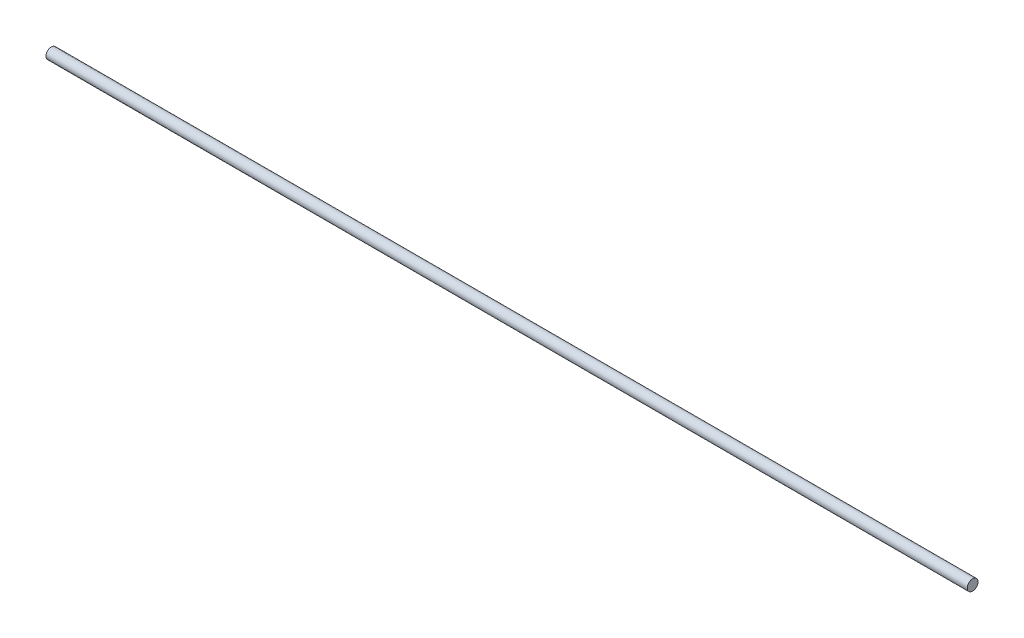
ISO-10303-21;
HEADER;
FILE_DESCRIPTION(('STEP AP214'),'2;1');
FILE_NAME('part.step','',(''),(''),'','','');
FILE_SCHEMA(('AUTOMOTIVE_DESIGN { 1 0 10303 214 1 1 1 1 }'));
ENDSEC;
DATA;
#1=APPLICATION_CONTEXT('core data for automotive mechanical design processes');
#2=APPLICATION_PROTOCOL_DEFINITION('international standard','automotive_design',2000,#1);
#3=PRODUCT_CONTEXT('',#1,'mechanical');
#4=PRODUCT('Part','Part','',(#3));
#5=PRODUCT_RELATED_PRODUCT_CATEGORY('part','',(#4));
#6=PRODUCT_DEFINITION_FORMATION('','',#4);
#7=PRODUCT_DEFINITION_CONTEXT('part definition',#1,'design');
#8=PRODUCT_DEFINITION('design','',#6,#7);
#9=PRODUCT_DEFINITION_SHAPE('','',#8);
#10=(LENGTH_UNIT() NAMED_UNIT(*) SI_UNIT(.MILLI.,.METRE.));
#11=(NAMED_UNIT(*) PLANE_ANGLE_UNIT() SI_UNIT($,.RADIAN.));
#12=(NAMED_UNIT(*) SI_UNIT($,.STERADIAN.) SOLID_ANGLE_UNIT());
#13=UNCERTAINTY_MEASURE_WITH_UNIT(LENGTH_MEASURE(1.E-05),#10,'distance_accuracy_value','');
#14=(GEOMETRIC_REPRESENTATION_CONTEXT(3) GLOBAL_UNCERTAINTY_ASSIGNED_CONTEXT((#13)) GLOBAL_UNIT_ASSIGNED_CONTEXT((#10,
#11,#12)) REPRESENTATION_CONTEXT('',''));
#15=CARTESIAN_POINT('',(0.,0.,0.));
#16=DIRECTION('',(0.,0.,1.));
#17=DIRECTION('',(1.,0.,0.));
#18=AXIS2_PLACEMENT_3D('',#15,#16,#17);
#19=CARTESIAN_POINT('',(150.,0.,0.));
#20=DIRECTION('',(-1.,0.,0.));
#21=DIRECTION('',(0.,0.,1.));
#22=AXIS2_PLACEMENT_3D('',#19,#20,#21);
#23=CYLINDRICAL_SURFACE('',#22,0.875);
#24=CARTESIAN_POINT('',(150.,0.,0.));
#25=DIRECTION('',(1.,0.,0.));
#26=DIRECTION('',(0.,0.,-1.));
#27=AXIS2_PLACEMENT_3D('',#24,#25,#26);
#28=CIRCLE('',#27,0.875);
#29=CARTESIAN_POINT('',(150.,0.,-0.875));
#30=VERTEX_POINT('',#29);
#31=EDGE_CURVE('E10',#30,#30,#28,.T.);
#32=ORIENTED_EDGE('',*,*,#31,.F.);
#33=EDGE_LOOP('',(#32));
#34=FACE_BOUND('',#33,.T.);
#35=CARTESIAN_POINT('',(0.,0.,0.));
#36=DIRECTION('',(1.,0.,0.));
#37=DIRECTION('',(0.,0.,-1.));
#38=AXIS2_PLACEMENT_3D('',#35,#36,#37);
#39=CIRCLE('',#38,0.875);
#40=CARTESIAN_POINT('',(0.,0.,-0.875));
#41=VERTEX_POINT('',#40);
#42=EDGE_CURVE('E32',#41,#41,#39,.T.);
#43=ORIENTED_EDGE('',*,*,#42,.T.);
#44=EDGE_LOOP('',(#43));
#45=FACE_BOUND('',#44,.T.);
#46=ADVANCED_FACE('F29',(#34,#45),#23,.T.);
#47=CARTESIAN_POINT('',(150.,0.,0.));
#48=DIRECTION('',(1.,0.,0.));
#49=DIRECTION('',(0.,0.,-1.));
#50=AXIS2_PLACEMENT_3D('',#47,#48,#49);
#51=PLANE('',#50);
#52=ORIENTED_EDGE('',*,*,#31,.T.);
#53=EDGE_LOOP('',(#52));
#54=FACE_BOUND('',#53,.T.);
#55=ADVANCED_FACE('F44',(#54),#51,.T.);
#56=CARTESIAN_POINT('',(0.,0.,0.));
#57=DIRECTION('',(1.,0.,0.));
#58=DIRECTION('',(0.,0.,-1.));
#59=AXIS2_PLACEMENT_3D('',#56,#57,#58);
#60=PLANE('',#59);
#61=ORIENTED_EDGE('',*,*,#42,.F.);
#62=EDGE_LOOP('',(#61));
#63=FACE_BOUND('',#62,.T.);
#64=ADVANCED_FACE('F42',(#63),#60,.F.);
#65=CLOSED_SHELL('',(#46,#55,#64));
#66=MANIFOLD_SOLID_BREP('B2',#65);
#67=ADVANCED_BREP_SHAPE_REPRESENTATION('',(#18,#66),#14);
#68=SHAPE_DEFINITION_REPRESENTATION(#9,#67);
ENDSEC;
END-ISO-10303-21;
